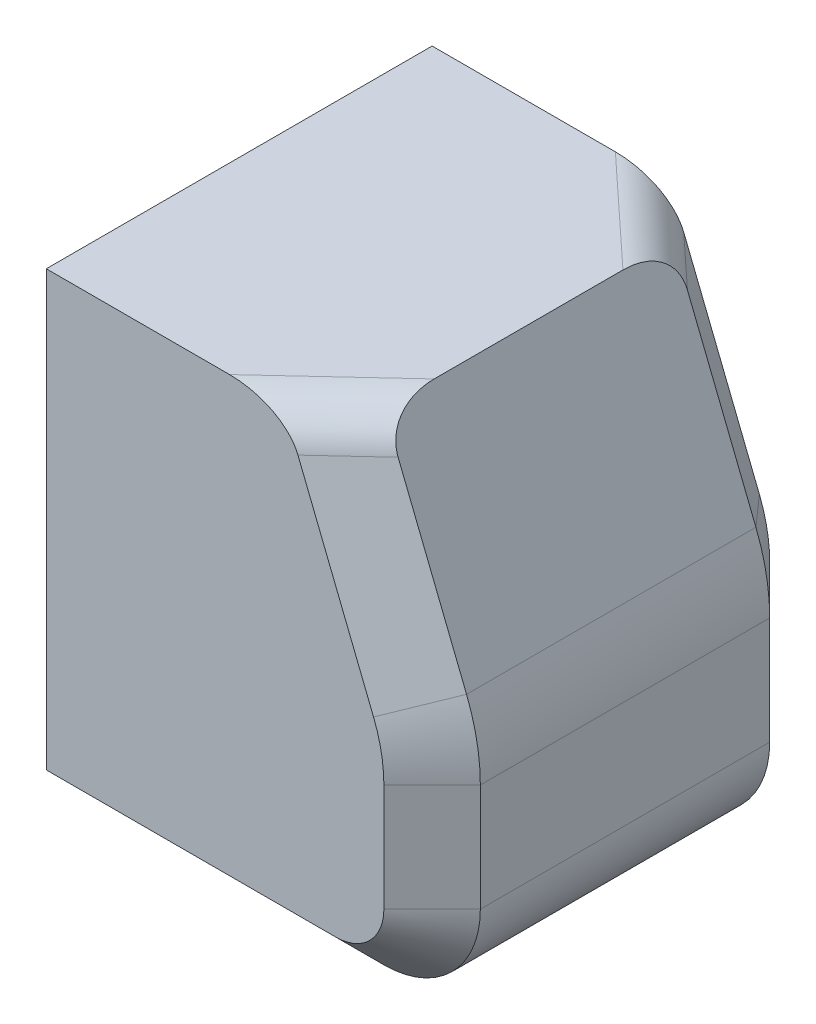
ISO-10303-21;
HEADER;
FILE_DESCRIPTION(('STEP AP214'),'2;1');
FILE_NAME('part.step','',(''),(''),'','','');
FILE_SCHEMA(('AUTOMOTIVE_DESIGN { 1 0 10303 214 1 1 1 1 }'));
ENDSEC;
DATA;
#1=APPLICATION_CONTEXT('core data for automotive mechanical design processes');
#2=APPLICATION_PROTOCOL_DEFINITION('international standard','automotive_design',2000,#1);
#3=PRODUCT_CONTEXT('',#1,'mechanical');
#4=PRODUCT('Part','Part','',(#3));
#5=PRODUCT_RELATED_PRODUCT_CATEGORY('part','',(#4));
#6=PRODUCT_DEFINITION_FORMATION('','',#4);
#7=PRODUCT_DEFINITION_CONTEXT('part definition',#1,'design');
#8=PRODUCT_DEFINITION('design','',#6,#7);
#9=PRODUCT_DEFINITION_SHAPE('','',#8);
#10=(LENGTH_UNIT() NAMED_UNIT(*) SI_UNIT(.MILLI.,.METRE.));
#11=(NAMED_UNIT(*) PLANE_ANGLE_UNIT() SI_UNIT($,.RADIAN.));
#12=(NAMED_UNIT(*) SI_UNIT($,.STERADIAN.) SOLID_ANGLE_UNIT());
#13=UNCERTAINTY_MEASURE_WITH_UNIT(LENGTH_MEASURE(1.E-05),#10,'distance_accuracy_value','');
#14=(GEOMETRIC_REPRESENTATION_CONTEXT(3) GLOBAL_UNCERTAINTY_ASSIGNED_CONTEXT((#13)) GLOBAL_UNIT_ASSIGNED_CONTEXT((#10,
#11,#12)) REPRESENTATION_CONTEXT('',''));
#15=CARTESIAN_POINT('',(0.,0.,0.));
#16=DIRECTION('',(0.,0.,1.));
#17=DIRECTION('',(1.,0.,0.));
#18=AXIS2_PLACEMENT_3D('',#15,#16,#17);
#19=CARTESIAN_POINT('',(29.9999999999999,0.,40.));
#20=DIRECTION('',(0.,1.,0.));
#21=DIRECTION('',(-1.,0.,0.));
#22=AXIS2_PLACEMENT_3D('',#19,#20,#21);
#23=PLANE('',#22);
#24=DIRECTION('',(0.,0.,-1.));
#25=VECTOR('',#24,1.);
#26=CARTESIAN_POINT('',(0.,0.,40.));
#27=LINE('',#26,#25);
#28=CARTESIAN_POINT('',(0.,0.,35.));
#29=VERTEX_POINT('',#28);
#30=CARTESIAN_POINT('',(0.,0.,5.));
#31=VERTEX_POINT('',#30);
#32=EDGE_CURVE('E171',#29,#31,#27,.T.);
#33=ORIENTED_EDGE('',*,*,#32,.T.);
#34=DIRECTION('',(1.,0.,0.));
#35=VECTOR('',#34,1.);
#36=CARTESIAN_POINT('',(29.9999999999999,0.,5.));
#37=LINE('',#36,#35);
#38=CARTESIAN_POINT('',(29.9999999999999,0.,5.));
#39=VERTEX_POINT('',#38);
#40=EDGE_CURVE('E199',#31,#39,#37,.T.);
#41=ORIENTED_EDGE('',*,*,#40,.T.);
#42=DIRECTION('',(0.,0.,-1.));
#43=VECTOR('',#42,1.);
#44=CARTESIAN_POINT('',(29.9999999999999,0.,40.));
#45=LINE('',#44,#43);
#46=CARTESIAN_POINT('',(29.9999999999999,0.,35.));
#47=VERTEX_POINT('',#46);
#48=EDGE_CURVE('E194',#47,#39,#45,.T.);
#49=ORIENTED_EDGE('',*,*,#48,.F.);
#50=DIRECTION('',(-1.,0.,0.));
#51=VECTOR('',#50,1.);
#52=CARTESIAN_POINT('',(29.9999999999999,0.,35.));
#53=LINE('',#52,#51);
#54=EDGE_CURVE('E197',#47,#29,#53,.T.);
#55=ORIENTED_EDGE('',*,*,#54,.T.);
#56=EDGE_LOOP('',(#33,#41,#49,#55));
#57=FACE_BOUND('',#56,.T.);
#58=ADVANCED_FACE('F41',(#57),#23,.F.);
#59=CARTESIAN_POINT('',(30.,10.,40.));
#60=DIRECTION('',(0.,0.,-1.));
#61=DIRECTION('',(-1.,0.,0.));
#62=AXIS2_PLACEMENT_3D('',#59,#60,#61);
#63=CYLINDRICAL_SURFACE('',#62,10.);
#64=ORIENTED_EDGE('',*,*,#48,.T.);
#65=CARTESIAN_POINT('',(30.,10.,5.));
#66=DIRECTION('',(0.,0.,-1.));
#67=DIRECTION('',(-1.,0.,0.));
#68=AXIS2_PLACEMENT_3D('',#65,#66,#67);
#69=CIRCLE('',#68,10.);
#70=CARTESIAN_POINT('',(40.,10.0000000000001,5.));
#71=VERTEX_POINT('',#70);
#72=EDGE_CURVE('E227',#39,#71,#69,.F.);
#73=ORIENTED_EDGE('',*,*,#72,.T.);
#74=DIRECTION('',(0.,0.,-1.));
#75=VECTOR('',#74,1.);
#76=CARTESIAN_POINT('',(40.,10.0000000000001,40.));
#77=LINE('',#76,#75);
#78=CARTESIAN_POINT('',(40.,10.0000000000001,35.));
#79=VERTEX_POINT('',#78);
#80=EDGE_CURVE('E191',#79,#71,#77,.T.);
#81=ORIENTED_EDGE('',*,*,#80,.F.);
#82=CARTESIAN_POINT('',(30.,10.,35.));
#83=DIRECTION('',(0.,0.,-1.));
#84=DIRECTION('',(-1.,0.,0.));
#85=AXIS2_PLACEMENT_3D('',#82,#83,#84);
#86=CIRCLE('',#85,10.);
#87=EDGE_CURVE('E225',#79,#47,#86,.T.);
#88=ORIENTED_EDGE('',*,*,#87,.T.);
#89=EDGE_LOOP('',(#64,#73,#81,#88));
#90=FACE_BOUND('',#89,.T.);
#91=ADVANCED_FACE('F335',(#90),#63,.T.);
#92=CARTESIAN_POINT('',(40.,21.148351928655,40.));
#93=DIRECTION('',(-1.,0.,0.));
#94=DIRECTION('',(0.,-1.,0.));
#95=AXIS2_PLACEMENT_3D('',#92,#93,#94);
#96=PLANE('',#95);
#97=ORIENTED_EDGE('',*,*,#80,.T.);
#98=DIRECTION('',(0.,1.,0.));
#99=VECTOR('',#98,1.);
#100=CARTESIAN_POINT('',(40.,21.148351928655,5.));
#101=LINE('',#100,#99);
#102=CARTESIAN_POINT('',(40.,21.148351928655,5.));
#103=VERTEX_POINT('',#102);
#104=EDGE_CURVE('E231',#71,#103,#101,.T.);
#105=ORIENTED_EDGE('',*,*,#104,.T.);
#106=DIRECTION('',(0.,0.,-1.));
#107=VECTOR('',#106,1.);
#108=CARTESIAN_POINT('',(40.,21.148351928655,40.));
#109=LINE('',#108,#107);
#110=CARTESIAN_POINT('',(40.,21.148351928655,35.));
#111=VERTEX_POINT('',#110);
#112=EDGE_CURVE('E188',#111,#103,#109,.T.);
#113=ORIENTED_EDGE('',*,*,#112,.F.);
#114=DIRECTION('',(0.,-1.,0.));
#115=VECTOR('',#114,1.);
#116=CARTESIAN_POINT('',(40.,21.148351928655,35.));
#117=LINE('',#116,#115);
#118=EDGE_CURVE('E229',#111,#79,#117,.T.);
#119=ORIENTED_EDGE('',*,*,#118,.T.);
#120=EDGE_LOOP('',(#97,#105,#113,#119));
#121=FACE_BOUND('',#120,.T.);
#122=ADVANCED_FACE('F340',(#121),#96,.F.);
#123=CARTESIAN_POINT('',(20.,21.148351928655,40.));
#124=DIRECTION('',(0.,0.,-1.));
#125=DIRECTION('',(-1.,0.,0.));
#126=AXIS2_PLACEMENT_3D('',#123,#124,#125);
#127=CYLINDRICAL_SURFACE('',#126,20.);
#128=ORIENTED_EDGE('',*,*,#112,.T.);
#129=CARTESIAN_POINT('',(20.,21.148351928655,5.));
#130=DIRECTION('',(0.,0.,-1.));
#131=DIRECTION('',(-1.,0.,0.));
#132=AXIS2_PLACEMENT_3D('',#129,#130,#131);
#133=CIRCLE('',#132,20.);
#134=CARTESIAN_POINT('',(38.5695338177052,28.5761654557371,5.));
#135=VERTEX_POINT('',#134);
#136=EDGE_CURVE('E235',#103,#135,#133,.F.);
#137=ORIENTED_EDGE('',*,*,#136,.T.);
#138=DIRECTION('',(0.,0.,-1.));
#139=VECTOR('',#138,1.);
#140=CARTESIAN_POINT('',(38.5695338177052,28.5761654557371,40.));
#141=LINE('',#140,#139);
#142=CARTESIAN_POINT('',(38.5695338177052,28.5761654557371,35.));
#143=VERTEX_POINT('',#142);
#144=EDGE_CURVE('E185',#143,#135,#141,.T.);
#145=ORIENTED_EDGE('',*,*,#144,.F.);
#146=CARTESIAN_POINT('',(20.,21.148351928655,35.));
#147=DIRECTION('',(0.,0.,-1.));
#148=DIRECTION('',(-1.,0.,0.));
#149=AXIS2_PLACEMENT_3D('',#146,#147,#148);
#150=CIRCLE('',#149,20.);
#151=EDGE_CURVE('E233',#143,#111,#150,.T.);
#152=ORIENTED_EDGE('',*,*,#151,.T.);
#153=EDGE_LOOP('',(#128,#137,#145,#152));
#154=FACE_BOUND('',#153,.T.);
#155=ADVANCED_FACE('F551',(#154),#127,.T.);
#156=CARTESIAN_POINT('',(30.,50.,40.));
#157=DIRECTION('',(-0.928476690885259,-0.371390676354103,0.));
#158=DIRECTION('',(0.371390676354103,-0.928476690885259,0.));
#159=AXIS2_PLACEMENT_3D('',#156,#157,#158);
#160=PLANE('',#159);
#161=DIRECTION('',(-0.371390676354103,0.928476690885259,0.));
#162=VECTOR('',#161,1.);
#163=CARTESIAN_POINT('',(30.,50.,5.));
#164=LINE('',#163,#162);
#165=CARTESIAN_POINT('',(31.4747742685611,46.3130643285972,5.));
#166=VERTEX_POINT('',#165);
#167=EDGE_CURVE('E239',#135,#166,#164,.T.);
#168=ORIENTED_EDGE('',*,*,#167,.T.);
#169=CARTESIAN_POINT('',(32.,45.,12.0710678118655));
#170=DIRECTION('',(-0.928476690885259,-0.371390676354103,0.));
#171=DIRECTION('',(0.137931034482759,-0.344827586206897,0.928476690885259));
#172=AXIS2_PLACEMENT_3D('',#169,#170,#171);
#173=ELLIPSE('',#172,7.34846922834952,5.);
#174=CARTESIAN_POINT('',(30.,50.,10.214114430095));
#175=VERTEX_POINT('',#174);
#176=EDGE_CURVE('E272',#166,#175,#173,.F.);
#177=ORIENTED_EDGE('',*,*,#176,.T.);
#178=DIRECTION('',(0.,0.,-1.));
#179=VECTOR('',#178,1.);
#180=CARTESIAN_POINT('',(30.,50.,40.));
#181=LINE('',#180,#179);
#182=CARTESIAN_POINT('',(30.,50.,29.785885569905));
#183=VERTEX_POINT('',#182);
#184=EDGE_CURVE('E170',#183,#175,#181,.T.);
#185=ORIENTED_EDGE('',*,*,#184,.F.);
#186=CARTESIAN_POINT('',(32.,45.,27.9289321881345));
#187=DIRECTION('',(-0.928476690885259,-0.371390676354103,0.));
#188=DIRECTION('',(0.137931034482758,-0.344827586206896,-0.92847669088526));
#189=AXIS2_PLACEMENT_3D('',#186,#187,#188);
#190=ELLIPSE('',#189,7.34846922834954,5.);
#191=CARTESIAN_POINT('',(31.4747742685611,46.3130643285972,35.));
#192=VERTEX_POINT('',#191);
#193=EDGE_CURVE('E63',#183,#192,#190,.F.);
#194=ORIENTED_EDGE('',*,*,#193,.T.);
#195=DIRECTION('',(0.371390676354103,-0.928476690885259,0.));
#196=VECTOR('',#195,1.);
#197=CARTESIAN_POINT('',(30.,50.,35.));
#198=LINE('',#197,#196);
#199=EDGE_CURVE('E237',#192,#143,#198,.T.);
#200=ORIENTED_EDGE('',*,*,#199,.T.);
#201=ORIENTED_EDGE('',*,*,#144,.T.);
#202=EDGE_LOOP('',(#168,#177,#185,#194,#200,#201));
#203=FACE_BOUND('',#202,.T.);
#204=ADVANCED_FACE('F274',(#203),#160,.F.);
#205=CARTESIAN_POINT('',(-1.71594593893318E-13,50.,40.));
#206=DIRECTION('',(0.,-1.,0.));
#207=DIRECTION('',(0.,0.,-1.));
#208=AXIS2_PLACEMENT_3D('',#205,#206,#207);
#209=PLANE('',#208);
#210=ORIENTED_EDGE('',*,*,#184,.T.);
#211=DIRECTION('',(-0.732828108792941,0.,-0.68041381743977));
#212=VECTOR('',#211,1.);
#213=CARTESIAN_POINT('',(22.014940236447,50.,2.80017256431027));
#214=LINE('',#213,#212);
#215=CARTESIAN_POINT('',(18.9990620870015,50.,0.));
#216=VERTEX_POINT('',#215);
#217=EDGE_CURVE('E265',#175,#216,#214,.T.);
#218=ORIENTED_EDGE('',*,*,#217,.T.);
#219=DIRECTION('',(-1.,0.,0.));
#220=VECTOR('',#219,1.);
#221=CARTESIAN_POINT('',(-1.71594593893318E-13,50.,0.));
#222=LINE('',#221,#220);
#223=CARTESIAN_POINT('',(-1.71594593893318E-13,50.,0.));
#224=VERTEX_POINT('',#223);
#225=EDGE_CURVE('E166',#216,#224,#222,.T.);
#226=ORIENTED_EDGE('',*,*,#225,.T.);
#227=DIRECTION('',(0.,0.,-1.));
#228=VECTOR('',#227,1.);
#229=CARTESIAN_POINT('',(-1.71594593893318E-13,50.,40.));
#230=LINE('',#229,#228);
#231=CARTESIAN_POINT('',(-1.71594593893318E-13,50.,40.));
#232=VERTEX_POINT('',#231);
#233=EDGE_CURVE('E161',#232,#224,#230,.T.);
#234=ORIENTED_EDGE('',*,*,#233,.F.);
#235=DIRECTION('',(-1.,0.,0.));
#236=VECTOR('',#235,1.);
#237=CARTESIAN_POINT('',(-1.71594593893318E-13,50.,40.));
#238=LINE('',#237,#236);
#239=CARTESIAN_POINT('',(18.9990620870016,50.,40.));
#240=VERTEX_POINT('',#239);
#241=EDGE_CURVE('E147',#240,#232,#238,.T.);
#242=ORIENTED_EDGE('',*,*,#241,.F.);
#243=DIRECTION('',(-0.732828108792939,0.,0.680413817439773));
#244=VECTOR('',#243,1.);
#245=CARTESIAN_POINT('',(27.4001050435815,50.,32.1998274356897));
#246=LINE('',#245,#244);
#247=EDGE_CURVE('E242',#240,#183,#246,.F.);
#248=ORIENTED_EDGE('',*,*,#247,.T.);
#249=EDGE_LOOP('',(#210,#218,#226,#234,#242,#248));
#250=FACE_BOUND('',#249,.T.);
#251=ADVANCED_FACE('F163',(#250),#209,.F.);
#252=CARTESIAN_POINT('',(0.,0.,40.));
#253=DIRECTION('',(1.,0.,0.));
#254=DIRECTION('',(0.,1.,0.));
#255=AXIS2_PLACEMENT_3D('',#252,#253,#254);
#256=PLANE('',#255);
#257=DIRECTION('',(0.,-1.,0.));
#258=VECTOR('',#257,1.);
#259=CARTESIAN_POINT('',(0.,0.,0.));
#260=LINE('',#259,#258);
#261=CARTESIAN_POINT('',(0.,5.00000000000002,0.));
#262=VERTEX_POINT('',#261);
#263=EDGE_CURVE('E158',#224,#262,#260,.T.);
#264=ORIENTED_EDGE('',*,*,#263,.T.);
#265=DIRECTION('',(0.,-0.707106781186549,0.707106781186546));
#266=VECTOR('',#265,1.);
#267=CARTESIAN_POINT('',(0.,0.,5.00000000000006));
#268=LINE('',#267,#266);
#269=EDGE_CURVE('E213',#262,#31,#268,.T.);
#270=ORIENTED_EDGE('',*,*,#269,.T.);
#271=ORIENTED_EDGE('',*,*,#32,.F.);
#272=DIRECTION('',(0.,-0.707106781186546,-0.707106781186549));
#273=VECTOR('',#272,1.);
#274=CARTESIAN_POINT('',(0.,4.99999999999997,40.));
#275=LINE('',#274,#273);
#276=CARTESIAN_POINT('',(0.,5.,40.));
#277=VERTEX_POINT('',#276);
#278=EDGE_CURVE('E176',#29,#277,#275,.F.);
#279=ORIENTED_EDGE('',*,*,#278,.T.);
#280=DIRECTION('',(0.,-1.,0.));
#281=VECTOR('',#280,1.);
#282=CARTESIAN_POINT('',(0.,0.,40.));
#283=LINE('',#282,#281);
#284=EDGE_CURVE('E152',#232,#277,#283,.T.);
#285=ORIENTED_EDGE('',*,*,#284,.F.);
#286=ORIENTED_EDGE('',*,*,#233,.T.);
#287=EDGE_LOOP('',(#264,#270,#271,#279,#285,#286));
#288=FACE_BOUND('',#287,.T.);
#289=ADVANCED_FACE('F173',(#288),#256,.F.);
#290=CARTESIAN_POINT('',(20.,21.148351928655,40.));
#291=DIRECTION('',(0.,0.,-1.));
#292=DIRECTION('',(-1.,0.,0.));
#293=AXIS2_PLACEMENT_3D('',#290,#291,#292);
#294=PLANE('',#293);
#295=DIRECTION('',(-0.371390676354104,0.928476690885259,0.));
#296=VECTOR('',#295,1.);
#297=CARTESIAN_POINT('',(33.9271503632789,26.7192120739665,40.));
#298=LINE('',#297,#296);
#299=CARTESIAN_POINT('',(33.9271503632789,26.7192120739665,40.));
#300=VERTEX_POINT('',#299);
#301=CARTESIAN_POINT('',(26.0896094614266,46.3130643285972,40.));
#302=VERTEX_POINT('',#301);
#303=EDGE_CURVE('E215',#300,#302,#298,.T.);
#304=ORIENTED_EDGE('',*,*,#303,.T.);
#305=CARTESIAN_POINT('',(18.9990620870016,45.,40.));
#306=DIRECTION('',(0.,0.,-1.));
#307=DIRECTION('',(1.,0.,0.));
#308=AXIS2_PLACEMENT_3D('',#305,#306,#307);
#309=ELLIPSE('',#308,7.34846922834952,5.);
#310=EDGE_CURVE('E11',#302,#240,#309,.F.);
#311=ORIENTED_EDGE('',*,*,#310,.T.);
#312=ORIENTED_EDGE('',*,*,#241,.T.);
#313=ORIENTED_EDGE('',*,*,#284,.T.);
#314=DIRECTION('',(1.,0.,0.));
#315=VECTOR('',#314,1.);
#316=CARTESIAN_POINT('',(20.,5.,40.));
#317=LINE('',#316,#315);
#318=CARTESIAN_POINT('',(29.9999999999999,5.00000000000001,40.));
#319=VERTEX_POINT('',#318);
#320=EDGE_CURVE('E223',#277,#319,#317,.T.);
#321=ORIENTED_EDGE('',*,*,#320,.T.);
#322=CARTESIAN_POINT('',(30.,10.,40.));
#323=DIRECTION('',(0.,0.,-1.));
#324=DIRECTION('',(-1.,0.,0.));
#325=AXIS2_PLACEMENT_3D('',#322,#323,#324);
#326=CIRCLE('',#325,4.99999999999999);
#327=CARTESIAN_POINT('',(35.,10.,40.));
#328=VERTEX_POINT('',#327);
#329=EDGE_CURVE('E221',#319,#328,#326,.F.);
#330=ORIENTED_EDGE('',*,*,#329,.T.);
#331=DIRECTION('',(0.,1.,0.));
#332=VECTOR('',#331,1.);
#333=CARTESIAN_POINT('',(35.,21.148351928655,40.));
#334=LINE('',#333,#332);
#335=CARTESIAN_POINT('',(35.,21.148351928655,40.));
#336=VERTEX_POINT('',#335);
#337=EDGE_CURVE('E219',#328,#336,#334,.T.);
#338=ORIENTED_EDGE('',*,*,#337,.T.);
#339=CARTESIAN_POINT('',(20.,21.148351928655,40.));
#340=DIRECTION('',(0.,0.,-1.));
#341=DIRECTION('',(-1.,0.,0.));
#342=AXIS2_PLACEMENT_3D('',#339,#340,#341);
#343=CIRCLE('',#342,15.);
#344=EDGE_CURVE('E217',#336,#300,#343,.F.);
#345=ORIENTED_EDGE('',*,*,#344,.T.);
#346=EDGE_LOOP('',(#304,#311,#312,#313,#321,#330,#338,#345));
#347=FACE_BOUND('',#346,.T.);
#348=ADVANCED_FACE('F149',(#347),#294,.F.);
#349=CARTESIAN_POINT('',(20.,21.148351928655,0.));
#350=DIRECTION('',(0.,0.,-1.));
#351=DIRECTION('',(-1.,0.,0.));
#352=AXIS2_PLACEMENT_3D('',#349,#350,#351);
#353=PLANE('',#352);
#354=ORIENTED_EDGE('',*,*,#225,.F.);
#355=CARTESIAN_POINT('',(18.9990620870015,45.,0.));
#356=DIRECTION('',(0.,0.,-1.));
#357=DIRECTION('',(1.,0.,0.));
#358=AXIS2_PLACEMENT_3D('',#355,#356,#357);
#359=ELLIPSE('',#358,7.34846922834955,5.);
#360=CARTESIAN_POINT('',(26.0896094614266,46.3130643285972,0.));
#361=VERTEX_POINT('',#360);
#362=EDGE_CURVE('E267',#216,#361,#359,.T.);
#363=ORIENTED_EDGE('',*,*,#362,.T.);
#364=DIRECTION('',(0.371390676354104,-0.928476690885259,0.));
#365=VECTOR('',#364,1.);
#366=CARTESIAN_POINT('',(33.9271503632789,26.7192120739665,0.));
#367=LINE('',#366,#365);
#368=CARTESIAN_POINT('',(33.9271503632789,26.7192120739665,0.));
#369=VERTEX_POINT('',#368);
#370=EDGE_CURVE('E202',#361,#369,#367,.T.);
#371=ORIENTED_EDGE('',*,*,#370,.T.);
#372=CARTESIAN_POINT('',(20.,21.148351928655,0.));
#373=DIRECTION('',(0.,0.,-1.));
#374=DIRECTION('',(-1.,0.,0.));
#375=AXIS2_PLACEMENT_3D('',#372,#373,#374);
#376=CIRCLE('',#375,15.);
#377=CARTESIAN_POINT('',(35.,21.148351928655,0.));
#378=VERTEX_POINT('',#377);
#379=EDGE_CURVE('E204',#369,#378,#376,.T.);
#380=ORIENTED_EDGE('',*,*,#379,.T.);
#381=DIRECTION('',(0.,-1.,0.));
#382=VECTOR('',#381,1.);
#383=CARTESIAN_POINT('',(35.,10.0000000000001,0.));
#384=LINE('',#383,#382);
#385=CARTESIAN_POINT('',(35.,10.,0.));
#386=VERTEX_POINT('',#385);
#387=EDGE_CURVE('E206',#378,#386,#384,.T.);
#388=ORIENTED_EDGE('',*,*,#387,.T.);
#389=CARTESIAN_POINT('',(30.,10.,0.));
#390=DIRECTION('',(0.,0.,-1.));
#391=DIRECTION('',(-1.,0.,0.));
#392=AXIS2_PLACEMENT_3D('',#389,#390,#391);
#393=CIRCLE('',#392,4.99999999999998);
#394=CARTESIAN_POINT('',(29.9999999999999,5.00000000000002,0.));
#395=VERTEX_POINT('',#394);
#396=EDGE_CURVE('E208',#386,#395,#393,.T.);
#397=ORIENTED_EDGE('',*,*,#396,.T.);
#398=DIRECTION('',(-1.,0.,0.));
#399=VECTOR('',#398,1.);
#400=CARTESIAN_POINT('',(0.,5.00000000000002,0.));
#401=LINE('',#400,#399);
#402=EDGE_CURVE('E210',#395,#262,#401,.T.);
#403=ORIENTED_EDGE('',*,*,#402,.T.);
#404=ORIENTED_EDGE('',*,*,#263,.F.);
#405=EDGE_LOOP('',(#354,#363,#371,#380,#388,#397,#403,#404));
#406=FACE_BOUND('',#405,.T.);
#407=ADVANCED_FACE('F282',(#406),#353,.T.);
#408=CARTESIAN_POINT('',(30.,50.,5.));
#409=DIRECTION('',(0.656532164298612,0.262612865719444,-0.707106781186549));
#410=DIRECTION('',(0.371390676354103,-0.928476690885259,0.));
#411=AXIS2_PLACEMENT_3D('',#408,#409,#410);
#412=PLANE('',#411);
#413=ORIENTED_EDGE('',*,*,#370,.F.);
#414=DIRECTION('',(-0.732828108792941,0.,-0.68041381743977));
#415=VECTOR('',#414,1.);
#416=CARTESIAN_POINT('',(30.6827658650746,46.3130643285972,4.26463865837752));
#417=LINE('',#416,#415);
#418=EDGE_CURVE('E269',#361,#166,#417,.F.);
#419=ORIENTED_EDGE('',*,*,#418,.T.);
#420=ORIENTED_EDGE('',*,*,#167,.F.);
#421=DIRECTION('',(0.656532164298614,0.262612865719446,0.707106781186546));
#422=VECTOR('',#421,1.);
#423=CARTESIAN_POINT('',(33.9271503632789,26.7192120739665,0.));
#424=LINE('',#423,#422);
#425=EDGE_CURVE('E182',#369,#135,#424,.T.);
#426=ORIENTED_EDGE('',*,*,#425,.F.);
#427=EDGE_LOOP('',(#413,#419,#420,#426));
#428=FACE_BOUND('',#427,.T.);
#429=ADVANCED_FACE('F285',(#428),#412,.T.);
#430=CARTESIAN_POINT('',(20.,21.148351928655,5.));
#431=DIRECTION('',(0.,0.,1.));
#432=DIRECTION('',(1.,0.,0.));
#433=AXIS2_PLACEMENT_3D('',#430,#431,#432);
#434=CONICAL_SURFACE('',#433,20.,0.78539816339745);
#435=ORIENTED_EDGE('',*,*,#425,.T.);
#436=ORIENTED_EDGE('',*,*,#136,.F.);
#437=DIRECTION('',(0.707106781186549,0.,0.707106781186546));
#438=VECTOR('',#437,1.);
#439=CARTESIAN_POINT('',(35.,21.148351928655,0.));
#440=LINE('',#439,#438);
#441=EDGE_CURVE('E249',#378,#103,#440,.T.);
#442=ORIENTED_EDGE('',*,*,#441,.F.);
#443=ORIENTED_EDGE('',*,*,#379,.F.);
#444=EDGE_LOOP('',(#435,#436,#442,#443));
#445=FACE_BOUND('',#444,.T.);
#446=ADVANCED_FACE('F290',(#445),#434,.T.);
#447=CARTESIAN_POINT('',(40.,21.148351928655,5.));
#448=DIRECTION('',(0.707106781186547,0.,-0.707106781186549));
#449=DIRECTION('',(0.,-1.,0.));
#450=AXIS2_PLACEMENT_3D('',#447,#448,#449);
#451=PLANE('',#450);
#452=ORIENTED_EDGE('',*,*,#441,.T.);
#453=ORIENTED_EDGE('',*,*,#104,.F.);
#454=DIRECTION('',(0.707106781186549,0.,0.707106781186547));
#455=VECTOR('',#454,1.);
#456=CARTESIAN_POINT('',(35.,10.,0.));
#457=LINE('',#456,#455);
#458=EDGE_CURVE('E245',#386,#71,#457,.T.);
#459=ORIENTED_EDGE('',*,*,#458,.F.);
#460=ORIENTED_EDGE('',*,*,#387,.F.);
#461=EDGE_LOOP('',(#452,#453,#459,#460));
#462=FACE_BOUND('',#461,.T.);
#463=ADVANCED_FACE('F297',(#462),#451,.T.);
#464=CARTESIAN_POINT('',(30.,10.,5.));
#465=DIRECTION('',(0.,0.,1.));
#466=DIRECTION('',(1.,0.,0.));
#467=AXIS2_PLACEMENT_3D('',#464,#465,#466);
#468=CONICAL_SURFACE('',#467,10.,0.78539816339745);
#469=ORIENTED_EDGE('',*,*,#458,.T.);
#470=ORIENTED_EDGE('',*,*,#72,.F.);
#471=DIRECTION('',(0.,-0.707106781186549,0.707106781186547));
#472=VECTOR('',#471,1.);
#473=CARTESIAN_POINT('',(29.9999999999999,5.00000000000002,0.));
#474=LINE('',#473,#472);
#475=EDGE_CURVE('E243',#395,#39,#474,.T.);
#476=ORIENTED_EDGE('',*,*,#475,.F.);
#477=ORIENTED_EDGE('',*,*,#396,.F.);
#478=EDGE_LOOP('',(#469,#470,#476,#477));
#479=FACE_BOUND('',#478,.T.);
#480=ADVANCED_FACE('F301',(#479),#468,.T.);
#481=CARTESIAN_POINT('',(29.9999999999999,0.,5.));
#482=DIRECTION('',(0.,-0.707106781186546,-0.707106781186549));
#483=DIRECTION('',(-1.,0.,0.));
#484=AXIS2_PLACEMENT_3D('',#481,#482,#483);
#485=PLANE('',#484);
#486=ORIENTED_EDGE('',*,*,#269,.F.);
#487=ORIENTED_EDGE('',*,*,#402,.F.);
#488=ORIENTED_EDGE('',*,*,#475,.T.);
#489=ORIENTED_EDGE('',*,*,#40,.F.);
#490=EDGE_LOOP('',(#486,#487,#488,#489));
#491=FACE_BOUND('',#490,.T.);
#492=ADVANCED_FACE('F305',(#491),#485,.T.);
#493=CARTESIAN_POINT('',(33.9271503632789,26.7192120739665,40.));
#494=DIRECTION('',(-0.656532164298613,-0.262612865719445,-0.707106781186547));
#495=DIRECTION('',(-0.371390676354103,0.928476690885259,0.));
#496=AXIS2_PLACEMENT_3D('',#493,#494,#495);
#497=PLANE('',#496);
#498=ORIENTED_EDGE('',*,*,#199,.F.);
#499=DIRECTION('',(0.732828108792939,0.,-0.680413817439773));
#500=VECTOR('',#499,1.);
#501=CARTESIAN_POINT('',(25.2976010579401,46.3130643285972,40.7353613416225));
#502=LINE('',#501,#500);
#503=EDGE_CURVE('E49',#192,#302,#502,.F.);
#504=ORIENTED_EDGE('',*,*,#503,.T.);
#505=ORIENTED_EDGE('',*,*,#303,.F.);
#506=DIRECTION('',(-0.656532164298612,-0.262612865719445,0.707106781186548));
#507=VECTOR('',#506,1.);
#508=CARTESIAN_POINT('',(38.5695338177052,28.5761654557371,35.));
#509=LINE('',#508,#507);
#510=EDGE_CURVE('E246',#143,#300,#509,.T.);
#511=ORIENTED_EDGE('',*,*,#510,.F.);
#512=EDGE_LOOP('',(#498,#504,#505,#511));
#513=FACE_BOUND('',#512,.T.);
#514=ADVANCED_FACE('F327',(#513),#497,.F.);
#515=CARTESIAN_POINT('',(20.,21.148351928655,40.));
#516=DIRECTION('',(0.,0.,-1.));
#517=DIRECTION('',(-1.,0.,0.));
#518=AXIS2_PLACEMENT_3D('',#515,#516,#517);
#519=CONICAL_SURFACE('',#518,15.,0.785398163397447);
#520=ORIENTED_EDGE('',*,*,#510,.T.);
#521=ORIENTED_EDGE('',*,*,#344,.F.);
#522=DIRECTION('',(-0.707106781186547,0.,0.707106781186549));
#523=VECTOR('',#522,1.);
#524=CARTESIAN_POINT('',(40.,21.148351928655,35.));
#525=LINE('',#524,#523);
#526=EDGE_CURVE('E259',#111,#336,#525,.T.);
#527=ORIENTED_EDGE('',*,*,#526,.F.);
#528=ORIENTED_EDGE('',*,*,#151,.F.);
#529=EDGE_LOOP('',(#520,#521,#527,#528));
#530=FACE_BOUND('',#529,.T.);
#531=ADVANCED_FACE('F325',(#530),#519,.T.);
#532=CARTESIAN_POINT('',(35.,21.148351928655,40.));
#533=DIRECTION('',(-0.707106781186549,0.,-0.707106781186547));
#534=DIRECTION('',(0.,1.,0.));
#535=AXIS2_PLACEMENT_3D('',#532,#533,#534);
#536=PLANE('',#535);
#537=ORIENTED_EDGE('',*,*,#526,.T.);
#538=ORIENTED_EDGE('',*,*,#337,.F.);
#539=DIRECTION('',(-0.707106781186547,0.,0.707106781186549));
#540=VECTOR('',#539,1.);
#541=CARTESIAN_POINT('',(40.,10.0000000000001,35.));
#542=LINE('',#541,#540);
#543=EDGE_CURVE('E256',#79,#328,#542,.T.);
#544=ORIENTED_EDGE('',*,*,#543,.F.);
#545=ORIENTED_EDGE('',*,*,#118,.F.);
#546=EDGE_LOOP('',(#537,#538,#544,#545));
#547=FACE_BOUND('',#546,.T.);
#548=ADVANCED_FACE('F320',(#547),#536,.F.);
#549=CARTESIAN_POINT('',(30.,10.,40.));
#550=DIRECTION('',(0.,0.,-1.));
#551=DIRECTION('',(-1.,0.,0.));
#552=AXIS2_PLACEMENT_3D('',#549,#550,#551);
#553=CONICAL_SURFACE('',#552,4.99999999999999,0.785398163397447);
#554=ORIENTED_EDGE('',*,*,#543,.T.);
#555=ORIENTED_EDGE('',*,*,#329,.F.);
#556=DIRECTION('',(0.,0.707106781186547,0.707106781186548));
#557=VECTOR('',#556,1.);
#558=CARTESIAN_POINT('',(29.9999999999999,0.,35.));
#559=LINE('',#558,#557);
#560=EDGE_CURVE('E254',#47,#319,#559,.T.);
#561=ORIENTED_EDGE('',*,*,#560,.F.);
#562=ORIENTED_EDGE('',*,*,#87,.F.);
#563=EDGE_LOOP('',(#554,#555,#561,#562));
#564=FACE_BOUND('',#563,.T.);
#565=ADVANCED_FACE('F315',(#564),#553,.T.);
#566=CARTESIAN_POINT('',(20.,5.,40.));
#567=DIRECTION('',(0.,0.707106781186549,-0.707106781186546));
#568=DIRECTION('',(1.,0.,0.));
#569=AXIS2_PLACEMENT_3D('',#566,#567,#568);
#570=PLANE('',#569);
#571=ORIENTED_EDGE('',*,*,#278,.F.);
#572=ORIENTED_EDGE('',*,*,#54,.F.);
#573=ORIENTED_EDGE('',*,*,#560,.T.);
#574=ORIENTED_EDGE('',*,*,#320,.F.);
#575=EDGE_LOOP('',(#571,#572,#573,#574));
#576=FACE_BOUND('',#575,.T.);
#577=ADVANCED_FACE('F311',(#576),#570,.F.);
#578=CARTESIAN_POINT('',(28.7409169185543,45.,9.04508513708465));
#579=DIRECTION('',(0.732828108792941,0.,0.68041381743977));
#580=DIRECTION('',(0.68041381743977,0.,-0.732828108792941));
#581=AXIS2_PLACEMENT_3D('',#578,#579,#580);
#582=CYLINDRICAL_SURFACE('',#581,5.);
#583=ORIENTED_EDGE('',*,*,#176,.F.);
#584=ORIENTED_EDGE('',*,*,#418,.F.);
#585=ORIENTED_EDGE('',*,*,#362,.F.);
#586=ORIENTED_EDGE('',*,*,#217,.F.);
#587=EDGE_LOOP('',(#583,#584,#585,#586));
#588=FACE_BOUND('',#587,.T.);
#589=ADVANCED_FACE('F279',(#588),#582,.T.);
#590=CARTESIAN_POINT('',(8.79586207731548,45.,49.4734333814338));
#591=DIRECTION('',(0.732828108792939,0.,-0.680413817439773));
#592=DIRECTION('',(-0.680413817439773,0.,-0.732828108792939));
#593=AXIS2_PLACEMENT_3D('',#590,#591,#592);
#594=CYLINDRICAL_SURFACE('',#593,5.);
#595=ORIENTED_EDGE('',*,*,#310,.F.);
#596=ORIENTED_EDGE('',*,*,#503,.F.);
#597=ORIENTED_EDGE('',*,*,#193,.F.);
#598=ORIENTED_EDGE('',*,*,#247,.F.);
#599=EDGE_LOOP('',(#595,#596,#597,#598));
#600=FACE_BOUND('',#599,.T.);
#601=ADVANCED_FACE('F43',(#600),#594,.T.);
#602=CLOSED_SHELL('',(#58,#91,#122,#155,#204,#251,#289,#348,#407,#429,#446,#463,#480,#492,#514,
#531,#548,#565,#577,#589,#601));
#603=MANIFOLD_SOLID_BREP('B2',#602);
#604=ADVANCED_BREP_SHAPE_REPRESENTATION('',(#18,#603),#14);
#605=SHAPE_DEFINITION_REPRESENTATION(#9,#604);
ENDSEC;
END-ISO-10303-21;
